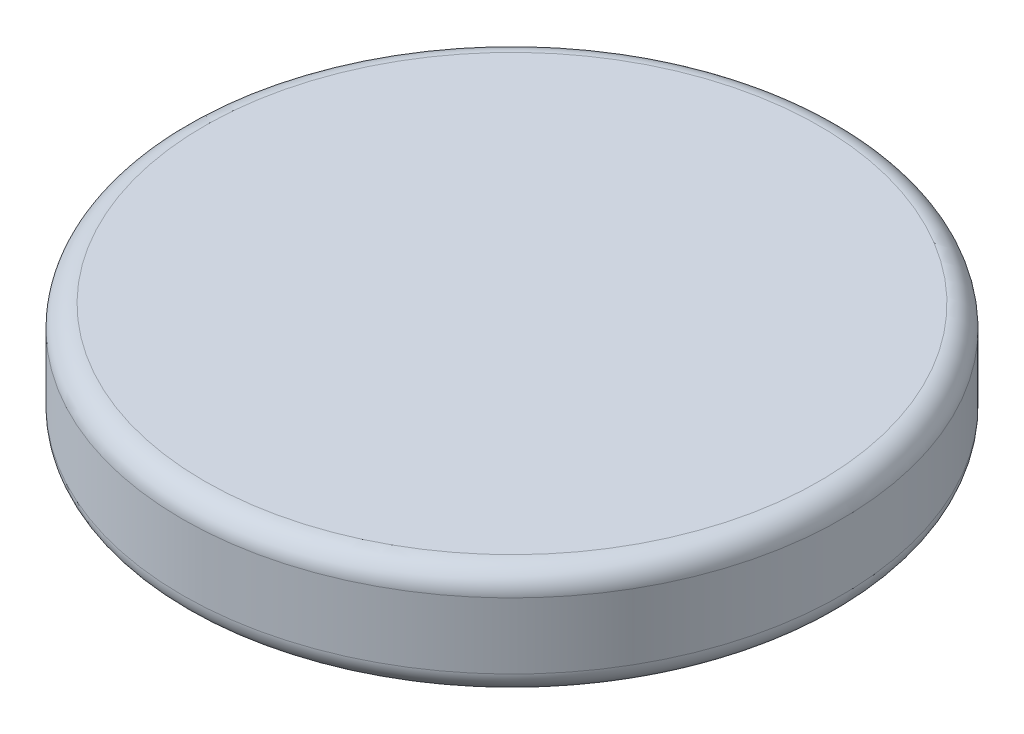
ISO-10303-21;
HEADER;
FILE_DESCRIPTION(('STEP AP214'),'2;1');
FILE_NAME('part.step','',(''),(''),'','','');
FILE_SCHEMA(('AUTOMOTIVE_DESIGN { 1 0 10303 214 1 1 1 1 }'));
ENDSEC;
DATA;
#1=APPLICATION_CONTEXT('core data for automotive mechanical design processes');
#2=APPLICATION_PROTOCOL_DEFINITION('international standard','automotive_design',2000,#1);
#3=PRODUCT_CONTEXT('',#1,'mechanical');
#4=PRODUCT('Part','Part','',(#3));
#5=PRODUCT_RELATED_PRODUCT_CATEGORY('part','',(#4));
#6=PRODUCT_DEFINITION_FORMATION('','',#4);
#7=PRODUCT_DEFINITION_CONTEXT('part definition',#1,'design');
#8=PRODUCT_DEFINITION('design','',#6,#7);
#9=PRODUCT_DEFINITION_SHAPE('','',#8);
#10=(LENGTH_UNIT() NAMED_UNIT(*) SI_UNIT(.MILLI.,.METRE.));
#11=(NAMED_UNIT(*) PLANE_ANGLE_UNIT() SI_UNIT($,.RADIAN.));
#12=(NAMED_UNIT(*) SI_UNIT($,.STERADIAN.) SOLID_ANGLE_UNIT());
#13=UNCERTAINTY_MEASURE_WITH_UNIT(LENGTH_MEASURE(1.E-05),#10,'distance_accuracy_value','');
#14=(GEOMETRIC_REPRESENTATION_CONTEXT(3) GLOBAL_UNCERTAINTY_ASSIGNED_CONTEXT((#13)) GLOBAL_UNIT_ASSIGNED_CONTEXT((#10,
#11,#12)) REPRESENTATION_CONTEXT('',''));
#15=CARTESIAN_POINT('',(0.,0.,0.));
#16=DIRECTION('',(0.,0.,1.));
#17=DIRECTION('',(1.,0.,0.));
#18=AXIS2_PLACEMENT_3D('',#15,#16,#17);
#19=CARTESIAN_POINT('',(0.,5.,0.));
#20=DIRECTION('',(0.,-1.,0.));
#21=DIRECTION('',(0.,0.,-1.));
#22=AXIS2_PLACEMENT_3D('',#19,#20,#21);
#23=CYLINDRICAL_SURFACE('',#22,15.);
#24=CARTESIAN_POINT('',(0.,1.,0.));
#25=DIRECTION('',(0.,1.,0.));
#26=DIRECTION('',(0.,0.,1.));
#27=AXIS2_PLACEMENT_3D('',#24,#25,#26);
#28=CIRCLE('',#27,15.);
#29=CARTESIAN_POINT('',(0.,1.,15.));
#30=VERTEX_POINT('',#29);
#31=EDGE_CURVE('E41',#30,#30,#28,.T.);
#32=ORIENTED_EDGE('',*,*,#31,.T.);
#33=EDGE_LOOP('',(#32));
#34=FACE_BOUND('',#33,.T.);
#35=CARTESIAN_POINT('',(0.,4.,0.));
#36=DIRECTION('',(0.,1.,0.));
#37=DIRECTION('',(0.,0.,1.));
#38=AXIS2_PLACEMENT_3D('',#35,#36,#37);
#39=CIRCLE('',#38,15.);
#40=CARTESIAN_POINT('',(0.,4.,15.));
#41=VERTEX_POINT('',#40);
#42=EDGE_CURVE('E45',#41,#41,#39,.F.);
#43=ORIENTED_EDGE('',*,*,#42,.T.);
#44=EDGE_LOOP('',(#43));
#45=FACE_BOUND('',#44,.T.);
#46=ADVANCED_FACE('F30',(#34,#45),#23,.T.);
#47=CARTESIAN_POINT('',(0.,5.,0.));
#48=DIRECTION('',(0.,1.,0.));
#49=DIRECTION('',(0.,0.,1.));
#50=AXIS2_PLACEMENT_3D('',#47,#48,#49);
#51=PLANE('',#50);
#52=CARTESIAN_POINT('',(0.,5.,0.));
#53=DIRECTION('',(0.,1.,0.));
#54=DIRECTION('',(0.,0.,1.));
#55=AXIS2_PLACEMENT_3D('',#52,#53,#54);
#56=CIRCLE('',#55,14.);
#57=CARTESIAN_POINT('',(0.,5.,14.));
#58=VERTEX_POINT('',#57);
#59=EDGE_CURVE('E10',#58,#58,#56,.T.);
#60=ORIENTED_EDGE('',*,*,#59,.T.);
#61=EDGE_LOOP('',(#60));
#62=FACE_BOUND('',#61,.T.);
#63=ADVANCED_FACE('F61',(#62),#51,.T.);
#64=CARTESIAN_POINT('',(0.,0.,0.));
#65=DIRECTION('',(0.,1.,0.));
#66=DIRECTION('',(0.,0.,1.));
#67=AXIS2_PLACEMENT_3D('',#64,#65,#66);
#68=PLANE('',#67);
#69=CARTESIAN_POINT('',(0.,0.,0.));
#70=DIRECTION('',(0.,1.,0.));
#71=DIRECTION('',(0.,0.,1.));
#72=AXIS2_PLACEMENT_3D('',#69,#70,#71);
#73=CIRCLE('',#72,14.);
#74=CARTESIAN_POINT('',(0.,0.,14.));
#75=VERTEX_POINT('',#74);
#76=EDGE_CURVE('E37',#75,#75,#73,.F.);
#77=ORIENTED_EDGE('',*,*,#76,.T.);
#78=EDGE_LOOP('',(#77));
#79=FACE_BOUND('',#78,.T.);
#80=ADVANCED_FACE('F58',(#79),#68,.F.);
#81=CARTESIAN_POINT('',(0.,1.,0.));
#82=DIRECTION('',(0.,1.,0.));
#83=DIRECTION('',(0.,0.,1.));
#84=AXIS2_PLACEMENT_3D('',#81,#82,#83);
#85=TOROIDAL_SURFACE('',#84,14.,1.);
#86=ORIENTED_EDGE('',*,*,#76,.F.);
#87=EDGE_LOOP('',(#86));
#88=FACE_BOUND('',#87,.T.);
#89=ORIENTED_EDGE('',*,*,#31,.F.);
#90=EDGE_LOOP('',(#89));
#91=FACE_BOUND('',#90,.T.);
#92=ADVANCED_FACE('F54',(#88,#91),#85,.T.);
#93=CARTESIAN_POINT('',(0.,4.,0.));
#94=DIRECTION('',(0.,1.,0.));
#95=DIRECTION('',(0.,0.,1.));
#96=AXIS2_PLACEMENT_3D('',#93,#94,#95);
#97=TOROIDAL_SURFACE('',#96,14.,1.);
#98=ORIENTED_EDGE('',*,*,#42,.F.);
#99=EDGE_LOOP('',(#98));
#100=FACE_BOUND('',#99,.T.);
#101=ORIENTED_EDGE('',*,*,#59,.F.);
#102=EDGE_LOOP('',(#101));
#103=FACE_BOUND('',#102,.T.);
#104=ADVANCED_FACE('F32',(#100,#103),#97,.T.);
#105=CLOSED_SHELL('',(#46,#63,#80,#92,#104));
#106=MANIFOLD_SOLID_BREP('B2',#105);
#107=ADVANCED_BREP_SHAPE_REPRESENTATION('',(#18,#106),#14);
#108=SHAPE_DEFINITION_REPRESENTATION(#9,#107);
ENDSEC;
END-ISO-10303-21;
